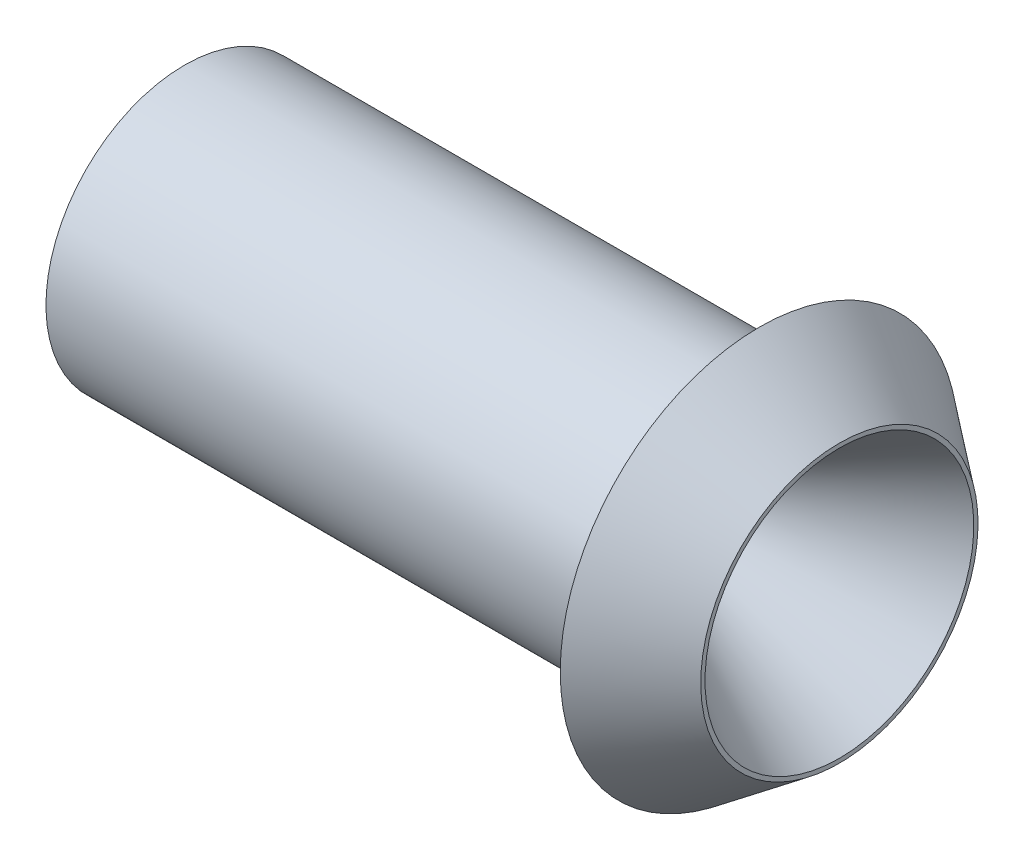
ISO-10303-21;
HEADER;
FILE_DESCRIPTION(('STEP AP214'),'2;1');
FILE_NAME('part.step','',(''),(''),'','','');
FILE_SCHEMA(('AUTOMOTIVE_DESIGN { 1 0 10303 214 1 1 1 1 }'));
ENDSEC;
DATA;
#1=APPLICATION_CONTEXT('core data for automotive mechanical design processes');
#2=APPLICATION_PROTOCOL_DEFINITION('international standard','automotive_design',2000,#1);
#3=PRODUCT_CONTEXT('',#1,'mechanical');
#4=PRODUCT('Part','Part','',(#3));
#5=PRODUCT_RELATED_PRODUCT_CATEGORY('part','',(#4));
#6=PRODUCT_DEFINITION_FORMATION('','',#4);
#7=PRODUCT_DEFINITION_CONTEXT('part definition',#1,'design');
#8=PRODUCT_DEFINITION('design','',#6,#7);
#9=PRODUCT_DEFINITION_SHAPE('','',#8);
#10=(LENGTH_UNIT() NAMED_UNIT(*) SI_UNIT(.MILLI.,.METRE.));
#11=(NAMED_UNIT(*) PLANE_ANGLE_UNIT() SI_UNIT($,.RADIAN.));
#12=(NAMED_UNIT(*) SI_UNIT($,.STERADIAN.) SOLID_ANGLE_UNIT());
#13=UNCERTAINTY_MEASURE_WITH_UNIT(LENGTH_MEASURE(1.E-05),#10,'distance_accuracy_value','');
#14=(GEOMETRIC_REPRESENTATION_CONTEXT(3) GLOBAL_UNCERTAINTY_ASSIGNED_CONTEXT((#13)) GLOBAL_UNIT_ASSIGNED_CONTEXT((#10,
#11,#12)) REPRESENTATION_CONTEXT('',''));
#15=CARTESIAN_POINT('',(0.,0.,0.));
#16=DIRECTION('',(0.,0.,1.));
#17=DIRECTION('',(1.,0.,0.));
#18=AXIS2_PLACEMENT_3D('',#15,#16,#17);
#19=CARTESIAN_POINT('',(28.889339450678,0.,0.));
#20=DIRECTION('',(-1.,0.,0.));
#21=DIRECTION('',(0.,-1.,0.));
#22=AXIS2_PLACEMENT_3D('',#19,#20,#21);
#23=CONICAL_SURFACE('',#22,2.90702999999999,0.174532925199433);
#24=CARTESIAN_POINT('',(0.,0.,0.));
#25=DIRECTION('',(1.,0.,0.));
#26=DIRECTION('',(0.,1.,0.));
#27=AXIS2_PLACEMENT_3D('',#24,#25,#26);
#28=CIRCLE('',#27,8.00099999999999);
#29=CARTESIAN_POINT('',(0.,8.00099999999999,0.));
#30=VERTEX_POINT('',#29);
#31=EDGE_CURVE('E80',#30,#30,#28,.T.);
#32=ORIENTED_EDGE('',*,*,#31,.F.);
#33=EDGE_LOOP('',(#32));
#34=FACE_BOUND('',#33,.T.);
#35=CARTESIAN_POINT('',(28.889339450678,0.,0.));
#36=DIRECTION('',(1.,0.,0.));
#37=DIRECTION('',(0.,1.,0.));
#38=AXIS2_PLACEMENT_3D('',#35,#36,#37);
#39=CIRCLE('',#38,2.90702999999999);
#40=CARTESIAN_POINT('',(28.889339450678,2.90702999999999,0.));
#41=VERTEX_POINT('',#40);
#42=EDGE_CURVE('E10',#41,#41,#39,.T.);
#43=ORIENTED_EDGE('',*,*,#42,.T.);
#44=EDGE_LOOP('',(#43));
#45=FACE_BOUND('',#44,.T.);
#46=ADVANCED_FACE('F45',(#34,#45),#23,.F.);
#47=CARTESIAN_POINT('',(38.9823543029096,0.,0.));
#48=DIRECTION('',(1.,0.,0.));
#49=DIRECTION('',(0.,1.,0.));
#50=AXIS2_PLACEMENT_3D('',#47,#48,#49);
#51=CYLINDRICAL_SURFACE('',#50,2.90702999999999);
#52=ORIENTED_EDGE('',*,*,#42,.F.);
#53=EDGE_LOOP('',(#52));
#54=FACE_BOUND('',#53,.T.);
#55=CARTESIAN_POINT('',(30.159339450678,0.,0.));
#56=DIRECTION('',(1.,0.,0.));
#57=DIRECTION('',(0.,1.,0.));
#58=AXIS2_PLACEMENT_3D('',#55,#56,#57);
#59=CIRCLE('',#58,2.90702999999999);
#60=CARTESIAN_POINT('',(30.159339450678,2.90702999999999,0.));
#61=VERTEX_POINT('',#60);
#62=EDGE_CURVE('E52',#61,#61,#59,.T.);
#63=ORIENTED_EDGE('',*,*,#62,.T.);
#64=EDGE_LOOP('',(#63));
#65=FACE_BOUND('',#64,.T.);
#66=ADVANCED_FACE('F88',(#54,#65),#51,.F.);
#67=CARTESIAN_POINT('',(38.9823543029096,0.,0.));
#68=DIRECTION('',(1.,0.,0.));
#69=DIRECTION('',(0.,1.,0.));
#70=AXIS2_PLACEMENT_3D('',#67,#68,#69);
#71=CONICAL_SURFACE('',#70,8.00100000000001,0.523598775598301);
#72=ORIENTED_EDGE('',*,*,#62,.F.);
#73=EDGE_LOOP('',(#72));
#74=FACE_BOUND('',#73,.T.);
#75=CARTESIAN_POINT('',(38.9823543029096,0.,0.));
#76=DIRECTION('',(1.,0.,0.));
#77=DIRECTION('',(0.,1.,0.));
#78=AXIS2_PLACEMENT_3D('',#75,#76,#77);
#79=CIRCLE('',#78,8.00100000000001);
#80=CARTESIAN_POINT('',(38.9823543029096,8.00100000000001,0.));
#81=VERTEX_POINT('',#80);
#82=EDGE_CURVE('E57',#81,#81,#79,.T.);
#83=ORIENTED_EDGE('',*,*,#82,.T.);
#84=EDGE_LOOP('',(#83));
#85=FACE_BOUND('',#84,.T.);
#86=ADVANCED_FACE('F92',(#74,#85),#71,.F.);
#87=CARTESIAN_POINT('',(38.9823543029096,0.,0.));
#88=DIRECTION('',(-1.,0.,0.));
#89=DIRECTION('',(0.,-1.,0.));
#90=AXIS2_PLACEMENT_3D('',#87,#88,#89);
#91=PLANE('',#90);
#92=ORIENTED_EDGE('',*,*,#82,.F.);
#93=EDGE_LOOP('',(#92));
#94=FACE_BOUND('',#93,.T.);
#95=CARTESIAN_POINT('',(38.9823543029096,0.,0.));
#96=DIRECTION('',(1.,0.,0.));
#97=DIRECTION('',(0.,1.,0.));
#98=AXIS2_PLACEMENT_3D('',#95,#96,#97);
#99=CIRCLE('',#98,8.255);
#100=CARTESIAN_POINT('',(38.9823543029096,8.255,0.));
#101=VERTEX_POINT('',#100);
#102=EDGE_CURVE('E62',#101,#101,#99,.T.);
#103=ORIENTED_EDGE('',*,*,#102,.T.);
#104=EDGE_LOOP('',(#103));
#105=FACE_BOUND('',#104,.T.);
#106=ADVANCED_FACE('F97',(#94,#105),#91,.F.);
#107=CARTESIAN_POINT('',(34.2128225095236,0.,0.));
#108=DIRECTION('',(-1.,0.,0.));
#109=DIRECTION('',(0.,-1.,0.));
#110=AXIS2_PLACEMENT_3D('',#107,#108,#109);
#111=CONICAL_SURFACE('',#110,11.8491,0.645771823237896);
#112=ORIENTED_EDGE('',*,*,#102,.F.);
#113=EDGE_LOOP('',(#112));
#114=FACE_BOUND('',#113,.T.);
#115=CARTESIAN_POINT('',(34.2128225095236,0.,0.));
#116=DIRECTION('',(1.,0.,0.));
#117=DIRECTION('',(0.,1.,0.));
#118=AXIS2_PLACEMENT_3D('',#115,#116,#117);
#119=CIRCLE('',#118,11.8491);
#120=CARTESIAN_POINT('',(34.2128225095236,11.8491,0.));
#121=VERTEX_POINT('',#120);
#122=EDGE_CURVE('E68',#121,#121,#119,.T.);
#123=ORIENTED_EDGE('',*,*,#122,.T.);
#124=EDGE_LOOP('',(#123));
#125=FACE_BOUND('',#124,.T.);
#126=ADVANCED_FACE('F103',(#114,#125),#111,.T.);
#127=CARTESIAN_POINT('',(34.2128225095236,0.,0.));
#128=DIRECTION('',(1.,0.,0.));
#129=DIRECTION('',(0.,1.,0.));
#130=AXIS2_PLACEMENT_3D('',#127,#128,#129);
#131=PLANE('',#130);
#132=ORIENTED_EDGE('',*,*,#122,.F.);
#133=EDGE_LOOP('',(#132));
#134=FACE_BOUND('',#133,.T.);
#135=CARTESIAN_POINT('',(34.2128225095236,0.,0.));
#136=DIRECTION('',(1.,0.,0.));
#137=DIRECTION('',(0.,1.,0.));
#138=AXIS2_PLACEMENT_3D('',#135,#136,#137);
#139=CIRCLE('',#138,8.25499999999999);
#140=CARTESIAN_POINT('',(34.2128225095236,8.255,0.));
#141=VERTEX_POINT('',#140);
#142=EDGE_CURVE('E72',#141,#141,#139,.T.);
#143=ORIENTED_EDGE('',*,*,#142,.T.);
#144=EDGE_LOOP('',(#143));
#145=FACE_BOUND('',#144,.T.);
#146=ADVANCED_FACE('F107',(#134,#145),#131,.F.);
#147=CARTESIAN_POINT('',(38.9823543029096,0.,0.));
#148=DIRECTION('',(1.,0.,0.));
#149=DIRECTION('',(0.,1.,0.));
#150=AXIS2_PLACEMENT_3D('',#147,#148,#149);
#151=CYLINDRICAL_SURFACE('',#150,8.25499999999999);
#152=ORIENTED_EDGE('',*,*,#142,.F.);
#153=EDGE_LOOP('',(#152));
#154=FACE_BOUND('',#153,.T.);
#155=CARTESIAN_POINT('',(0.,0.,0.));
#156=DIRECTION('',(1.,0.,0.));
#157=DIRECTION('',(0.,1.,0.));
#158=AXIS2_PLACEMENT_3D('',#155,#156,#157);
#159=CIRCLE('',#158,8.25499999999999);
#160=CARTESIAN_POINT('',(0.,8.25499999999999,0.));
#161=VERTEX_POINT('',#160);
#162=EDGE_CURVE('E76',#161,#161,#159,.T.);
#163=ORIENTED_EDGE('',*,*,#162,.T.);
#164=EDGE_LOOP('',(#163));
#165=FACE_BOUND('',#164,.T.);
#166=ADVANCED_FACE('F111',(#154,#165),#151,.T.);
#167=CARTESIAN_POINT('',(0.,0.,0.));
#168=DIRECTION('',(1.,0.,0.));
#169=DIRECTION('',(0.,1.,0.));
#170=AXIS2_PLACEMENT_3D('',#167,#168,#169);
#171=PLANE('',#170);
#172=ORIENTED_EDGE('',*,*,#162,.F.);
#173=EDGE_LOOP('',(#172));
#174=FACE_BOUND('',#173,.T.);
#175=ORIENTED_EDGE('',*,*,#31,.T.);
#176=EDGE_LOOP('',(#175));
#177=FACE_BOUND('',#176,.T.);
#178=ADVANCED_FACE('F85',(#174,#177),#171,.F.);
#179=CLOSED_SHELL('',(#46,#66,#86,#106,#126,#146,#166,#178));
#180=MANIFOLD_SOLID_BREP('B2',#179);
#181=ADVANCED_BREP_SHAPE_REPRESENTATION('',(#18,#180),#14);
#182=SHAPE_DEFINITION_REPRESENTATION(#9,#181);
ENDSEC;
END-ISO-10303-21;
